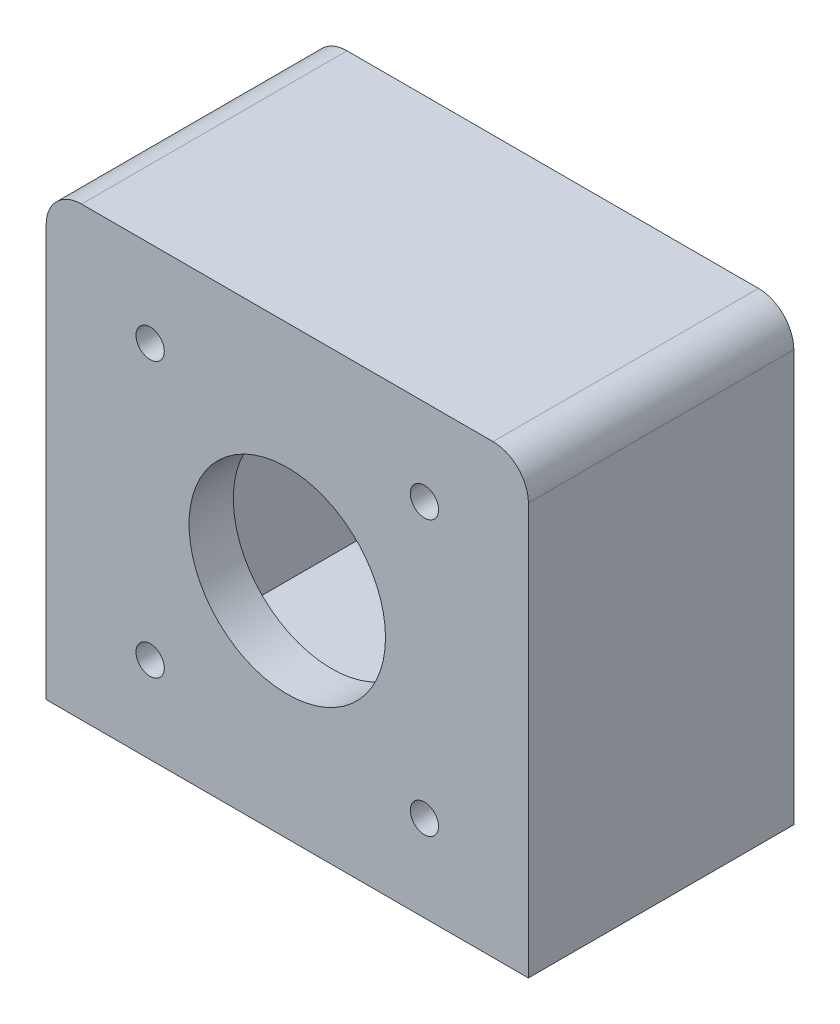
ISO-10303-21;
HEADER;
FILE_DESCRIPTION(('STEP AP214'),'2;1');
FILE_NAME('part.step','',(''),(''),'','','');
FILE_SCHEMA(('AUTOMOTIVE_DESIGN { 1 0 10303 214 1 1 1 1 }'));
ENDSEC;
DATA;
#1=APPLICATION_CONTEXT('core data for automotive mechanical design processes');
#2=APPLICATION_PROTOCOL_DEFINITION('international standard','automotive_design',2000,#1);
#3=PRODUCT_CONTEXT('',#1,'mechanical');
#4=PRODUCT('Part','Part','',(#3));
#5=PRODUCT_RELATED_PRODUCT_CATEGORY('part','',(#4));
#6=PRODUCT_DEFINITION_FORMATION('','',#4);
#7=PRODUCT_DEFINITION_CONTEXT('part definition',#1,'design');
#8=PRODUCT_DEFINITION('design','',#6,#7);
#9=PRODUCT_DEFINITION_SHAPE('','',#8);
#10=(LENGTH_UNIT() NAMED_UNIT(*) SI_UNIT(.MILLI.,.METRE.));
#11=(NAMED_UNIT(*) PLANE_ANGLE_UNIT() SI_UNIT($,.RADIAN.));
#12=(NAMED_UNIT(*) SI_UNIT($,.STERADIAN.) SOLID_ANGLE_UNIT());
#13=UNCERTAINTY_MEASURE_WITH_UNIT(LENGTH_MEASURE(1.E-05),#10,'distance_accuracy_value','');
#14=(GEOMETRIC_REPRESENTATION_CONTEXT(3) GLOBAL_UNCERTAINTY_ASSIGNED_CONTEXT((#13)) GLOBAL_UNIT_ASSIGNED_CONTEXT((#10,
#11,#12)) REPRESENTATION_CONTEXT('',''));
#15=CARTESIAN_POINT('',(0.,0.,0.));
#16=DIRECTION('',(0.,0.,1.));
#17=DIRECTION('',(1.,0.,0.));
#18=AXIS2_PLACEMENT_3D('',#15,#16,#17);
#19=CARTESIAN_POINT('',(0.,0.,0.));
#20=DIRECTION('',(0.,0.,1.));
#21=DIRECTION('',(1.,0.,0.));
#22=AXIS2_PLACEMENT_3D('',#19,#20,#21);
#23=PLANE('',#22);
#24=DIRECTION('',(0.,1.,0.));
#25=VECTOR('',#24,1.);
#26=CARTESIAN_POINT('',(21.25,-21.25,0.));
#27=LINE('',#26,#25);
#28=CARTESIAN_POINT('',(21.25,-21.25,0.));
#29=VERTEX_POINT('',#28);
#30=CARTESIAN_POINT('',(21.25,21.25,0.));
#31=VERTEX_POINT('',#30);
#32=EDGE_CURVE('E152',#29,#31,#27,.T.);
#33=ORIENTED_EDGE('',*,*,#32,.T.);
#34=DIRECTION('',(-1.,0.,0.));
#35=VECTOR('',#34,1.);
#36=CARTESIAN_POINT('',(-21.25,21.25,0.));
#37=LINE('',#36,#35);
#38=CARTESIAN_POINT('',(-21.25,21.25,0.));
#39=VERTEX_POINT('',#38);
#40=EDGE_CURVE('E186',#31,#39,#37,.T.);
#41=ORIENTED_EDGE('',*,*,#40,.T.);
#42=DIRECTION('',(0.,-1.,0.));
#43=VECTOR('',#42,1.);
#44=CARTESIAN_POINT('',(-21.25,-21.25,0.));
#45=LINE('',#44,#43);
#46=CARTESIAN_POINT('',(-21.25,-21.25,0.));
#47=VERTEX_POINT('',#46);
#48=EDGE_CURVE('E189',#39,#47,#45,.T.);
#49=ORIENTED_EDGE('',*,*,#48,.T.);
#50=DIRECTION('',(1.,0.,0.));
#51=VECTOR('',#50,1.);
#52=CARTESIAN_POINT('',(-21.25,-21.25,0.));
#53=LINE('',#52,#51);
#54=EDGE_CURVE('E174',#47,#29,#53,.T.);
#55=ORIENTED_EDGE('',*,*,#54,.T.);
#56=EDGE_LOOP('',(#33,#41,#49,#55));
#57=FACE_BOUND('',#56,.T.);
#58=DIRECTION('',(0.,-1.,0.));
#59=VECTOR('',#58,1.);
#60=CARTESIAN_POINT('',(-27.25,25.25,0.));
#61=LINE('',#60,#59);
#62=CARTESIAN_POINT('',(-27.25,21.25,0.));
#63=VERTEX_POINT('',#62);
#64=CARTESIAN_POINT('',(-27.25,-25.25,0.));
#65=VERTEX_POINT('',#64);
#66=EDGE_CURVE('E229',#63,#65,#61,.T.);
#67=ORIENTED_EDGE('',*,*,#66,.F.);
#68=CARTESIAN_POINT('',(-23.25,21.25,0.));
#69=DIRECTION('',(0.,0.,-1.));
#70=DIRECTION('',(-1.,0.,0.));
#71=AXIS2_PLACEMENT_3D('',#68,#69,#70);
#72=CIRCLE('',#71,4.);
#73=CARTESIAN_POINT('',(-23.25,25.25,0.));
#74=VERTEX_POINT('',#73);
#75=EDGE_CURVE('E56',#74,#63,#72,.F.);
#76=ORIENTED_EDGE('',*,*,#75,.F.);
#77=DIRECTION('',(-1.,0.,0.));
#78=VECTOR('',#77,1.);
#79=CARTESIAN_POINT('',(-25.25,25.25,0.));
#80=LINE('',#79,#78);
#81=CARTESIAN_POINT('',(23.25,25.25,0.));
#82=VERTEX_POINT('',#81);
#83=EDGE_CURVE('E11',#82,#74,#80,.T.);
#84=ORIENTED_EDGE('',*,*,#83,.F.);
#85=CARTESIAN_POINT('',(23.25,21.25,0.));
#86=DIRECTION('',(0.,0.,-1.));
#87=DIRECTION('',(-1.,0.,0.));
#88=AXIS2_PLACEMENT_3D('',#85,#86,#87);
#89=CIRCLE('',#88,4.);
#90=CARTESIAN_POINT('',(27.25,21.25,0.));
#91=VERTEX_POINT('',#90);
#92=EDGE_CURVE('E304',#82,#91,#89,.T.);
#93=ORIENTED_EDGE('',*,*,#92,.T.);
#94=DIRECTION('',(0.,1.,0.));
#95=VECTOR('',#94,1.);
#96=CARTESIAN_POINT('',(27.25,25.25,0.));
#97=LINE('',#96,#95);
#98=CARTESIAN_POINT('',(27.25,-25.25,0.));
#99=VERTEX_POINT('',#98);
#100=EDGE_CURVE('E222',#99,#91,#97,.T.);
#101=ORIENTED_EDGE('',*,*,#100,.F.);
#102=DIRECTION('',(1.,0.,0.));
#103=VECTOR('',#102,1.);
#104=CARTESIAN_POINT('',(-25.25,-25.25,0.));
#105=LINE('',#104,#103);
#106=EDGE_CURVE('E48',#65,#99,#105,.T.);
#107=ORIENTED_EDGE('',*,*,#106,.F.);
#108=EDGE_LOOP('',(#67,#76,#84,#93,#101,#107));
#109=FACE_BOUND('',#108,.T.);
#110=ADVANCED_FACE('F39',(#57,#109),#23,.F.);
#111=CARTESIAN_POINT('',(0.,0.,30.));
#112=DIRECTION('',(0.,0.,1.));
#113=DIRECTION('',(1.,0.,0.));
#114=AXIS2_PLACEMENT_3D('',#111,#112,#113);
#115=PLANE('',#114);
#116=CARTESIAN_POINT('',(-23.25,21.25,30.));
#117=DIRECTION('',(0.,0.,-1.));
#118=DIRECTION('',(-1.,0.,0.));
#119=AXIS2_PLACEMENT_3D('',#116,#117,#118);
#120=CIRCLE('',#119,4.);
#121=CARTESIAN_POINT('',(-23.25,25.25,30.));
#122=VERTEX_POINT('',#121);
#123=CARTESIAN_POINT('',(-27.25,21.25,30.));
#124=VERTEX_POINT('',#123);
#125=EDGE_CURVE('E116',#122,#124,#120,.F.);
#126=ORIENTED_EDGE('',*,*,#125,.T.);
#127=DIRECTION('',(0.,1.,0.));
#128=VECTOR('',#127,1.);
#129=CARTESIAN_POINT('',(-27.25,25.25,30.));
#130=LINE('',#129,#128);
#131=CARTESIAN_POINT('',(-27.25,-25.25,30.));
#132=VERTEX_POINT('',#131);
#133=EDGE_CURVE('E157',#132,#124,#130,.T.);
#134=ORIENTED_EDGE('',*,*,#133,.F.);
#135=DIRECTION('',(1.,0.,0.));
#136=VECTOR('',#135,1.);
#137=CARTESIAN_POINT('',(0.,-25.25,30.));
#138=LINE('',#137,#136);
#139=CARTESIAN_POINT('',(27.25,-25.25,30.));
#140=VERTEX_POINT('',#139);
#141=EDGE_CURVE('E136',#132,#140,#138,.T.);
#142=ORIENTED_EDGE('',*,*,#141,.T.);
#143=DIRECTION('',(0.,-1.,0.));
#144=VECTOR('',#143,1.);
#145=CARTESIAN_POINT('',(27.25,25.25,30.));
#146=LINE('',#145,#144);
#147=CARTESIAN_POINT('',(27.25,21.25,30.));
#148=VERTEX_POINT('',#147);
#149=EDGE_CURVE('E215',#148,#140,#146,.T.);
#150=ORIENTED_EDGE('',*,*,#149,.F.);
#151=CARTESIAN_POINT('',(23.25,21.25,30.));
#152=DIRECTION('',(0.,0.,-1.));
#153=DIRECTION('',(-1.,0.,0.));
#154=AXIS2_PLACEMENT_3D('',#151,#152,#153);
#155=CIRCLE('',#154,4.);
#156=CARTESIAN_POINT('',(23.25,25.25,30.));
#157=VERTEX_POINT('',#156);
#158=EDGE_CURVE('E64',#157,#148,#155,.T.);
#159=ORIENTED_EDGE('',*,*,#158,.F.);
#160=DIRECTION('',(1.,0.,0.));
#161=VECTOR('',#160,1.);
#162=CARTESIAN_POINT('',(0.,25.25,30.));
#163=LINE('',#162,#161);
#164=EDGE_CURVE('E130',#122,#157,#163,.T.);
#165=ORIENTED_EDGE('',*,*,#164,.F.);
#166=EDGE_LOOP('',(#126,#134,#142,#150,#159,#165));
#167=FACE_BOUND('',#166,.T.);
#168=CARTESIAN_POINT('',(0.,0.,30.));
#169=DIRECTION('',(0.,0.,1.));
#170=DIRECTION('',(1.,0.,0.));
#171=AXIS2_PLACEMENT_3D('',#168,#169,#170);
#172=CIRCLE('',#171,11.1);
#173=CARTESIAN_POINT('',(11.1,0.,30.));
#174=VERTEX_POINT('',#173);
#175=EDGE_CURVE('E169',#174,#174,#172,.T.);
#176=ORIENTED_EDGE('',*,*,#175,.F.);
#177=EDGE_LOOP('',(#176));
#178=FACE_BOUND('',#177,.T.);
#179=CARTESIAN_POINT('',(15.5,15.5,30.));
#180=DIRECTION('',(0.,0.,1.));
#181=DIRECTION('',(1.,0.,0.));
#182=AXIS2_PLACEMENT_3D('',#179,#180,#181);
#183=CIRCLE('',#182,1.6);
#184=CARTESIAN_POINT('',(17.1,15.5,30.));
#185=VERTEX_POINT('',#184);
#186=EDGE_CURVE('E143',#185,#185,#183,.F.);
#187=ORIENTED_EDGE('',*,*,#186,.T.);
#188=EDGE_LOOP('',(#187));
#189=FACE_BOUND('',#188,.T.);
#190=CARTESIAN_POINT('',(-15.5,15.5,30.));
#191=DIRECTION('',(0.,0.,1.));
#192=DIRECTION('',(1.,0.,0.));
#193=AXIS2_PLACEMENT_3D('',#190,#191,#192);
#194=CIRCLE('',#193,1.6);
#195=CARTESIAN_POINT('',(-13.9,15.5,30.));
#196=VERTEX_POINT('',#195);
#197=EDGE_CURVE('E137',#196,#196,#194,.T.);
#198=ORIENTED_EDGE('',*,*,#197,.F.);
#199=EDGE_LOOP('',(#198));
#200=FACE_BOUND('',#199,.T.);
#201=CARTESIAN_POINT('',(15.5,-15.5,30.));
#202=DIRECTION('',(0.,0.,1.));
#203=DIRECTION('',(1.,0.,0.));
#204=AXIS2_PLACEMENT_3D('',#201,#202,#203);
#205=CIRCLE('',#204,1.6);
#206=CARTESIAN_POINT('',(17.1,-15.5,30.));
#207=VERTEX_POINT('',#206);
#208=EDGE_CURVE('E140',#207,#207,#205,.T.);
#209=ORIENTED_EDGE('',*,*,#208,.F.);
#210=EDGE_LOOP('',(#209));
#211=FACE_BOUND('',#210,.T.);
#212=CARTESIAN_POINT('',(-15.5,-15.5,30.));
#213=DIRECTION('',(0.,0.,1.));
#214=DIRECTION('',(1.,0.,0.));
#215=AXIS2_PLACEMENT_3D('',#212,#213,#214);
#216=CIRCLE('',#215,1.6);
#217=CARTESIAN_POINT('',(-13.9,-15.5,30.));
#218=VERTEX_POINT('',#217);
#219=EDGE_CURVE('E149',#218,#218,#216,.F.);
#220=ORIENTED_EDGE('',*,*,#219,.T.);
#221=EDGE_LOOP('',(#220));
#222=FACE_BOUND('',#221,.T.);
#223=ADVANCED_FACE('F133',(#167,#178,#189,#200,#211,#222),#115,.T.);
#224=CARTESIAN_POINT('',(-25.25,-25.25,25.));
#225=DIRECTION('',(0.,1.,0.));
#226=DIRECTION('',(0.,0.,1.));
#227=AXIS2_PLACEMENT_3D('',#224,#225,#226);
#228=PLANE('',#227);
#229=CARTESIAN_POINT('',(24.25,-25.25,27.));
#230=DIRECTION('',(0.,1.,0.));
#231=DIRECTION('',(0.,0.,1.));
#232=AXIS2_PLACEMENT_3D('',#229,#230,#231);
#233=CIRCLE('',#232,1.95);
#234=CARTESIAN_POINT('',(24.25,-25.25,28.95));
#235=VERTEX_POINT('',#234);
#236=EDGE_CURVE('E43',#235,#235,#233,.T.);
#237=ORIENTED_EDGE('',*,*,#236,.T.);
#238=EDGE_LOOP('',(#237));
#239=FACE_BOUND('',#238,.T.);
#240=CARTESIAN_POINT('',(-24.2500000000003,-25.25,26.9999999999997));
#241=DIRECTION('',(0.,1.,0.));
#242=DIRECTION('',(0.,0.,1.));
#243=AXIS2_PLACEMENT_3D('',#240,#241,#242);
#244=CIRCLE('',#243,1.95);
#245=CARTESIAN_POINT('',(-24.2500000000003,-25.25,28.9499999999997));
#246=VERTEX_POINT('',#245);
#247=EDGE_CURVE('E210',#246,#246,#244,.T.);
#248=ORIENTED_EDGE('',*,*,#247,.T.);
#249=EDGE_LOOP('',(#248));
#250=FACE_BOUND('',#249,.T.);
#251=CARTESIAN_POINT('',(-24.2500000000003,-25.25,3.00000000000031));
#252=DIRECTION('',(0.,1.,0.));
#253=DIRECTION('',(0.,0.,1.));
#254=AXIS2_PLACEMENT_3D('',#251,#252,#253);
#255=CIRCLE('',#254,1.95);
#256=CARTESIAN_POINT('',(-24.2500000000003,-25.25,4.95000000000031));
#257=VERTEX_POINT('',#256);
#258=EDGE_CURVE('E207',#257,#257,#255,.T.);
#259=ORIENTED_EDGE('',*,*,#258,.T.);
#260=EDGE_LOOP('',(#259));
#261=FACE_BOUND('',#260,.T.);
#262=CARTESIAN_POINT('',(24.25,-25.25,3.));
#263=DIRECTION('',(0.,1.,0.));
#264=DIRECTION('',(0.,0.,1.));
#265=AXIS2_PLACEMENT_3D('',#262,#263,#264);
#266=CIRCLE('',#265,1.95);
#267=CARTESIAN_POINT('',(24.25,-25.25,4.95));
#268=VERTEX_POINT('',#267);
#269=EDGE_CURVE('E204',#268,#268,#266,.T.);
#270=ORIENTED_EDGE('',*,*,#269,.T.);
#271=EDGE_LOOP('',(#270));
#272=FACE_BOUND('',#271,.T.);
#273=ORIENTED_EDGE('',*,*,#106,.T.);
#274=DIRECTION('',(0.,0.,-1.));
#275=VECTOR('',#274,1.);
#276=CARTESIAN_POINT('',(27.25,-25.25,30.));
#277=LINE('',#276,#275);
#278=EDGE_CURVE('E218',#140,#99,#277,.T.);
#279=ORIENTED_EDGE('',*,*,#278,.F.);
#280=ORIENTED_EDGE('',*,*,#141,.F.);
#281=DIRECTION('',(0.,0.,1.));
#282=VECTOR('',#281,1.);
#283=CARTESIAN_POINT('',(-27.25,-25.25,0.));
#284=LINE('',#283,#282);
#285=EDGE_CURVE('E231',#65,#132,#284,.T.);
#286=ORIENTED_EDGE('',*,*,#285,.F.);
#287=EDGE_LOOP('',(#273,#279,#280,#286));
#288=FACE_BOUND('',#287,.T.);
#289=ADVANCED_FACE('F41',(#239,#250,#261,#272,#288),#228,.F.);
#290=CARTESIAN_POINT('',(-25.25,25.25,25.));
#291=DIRECTION('',(0.,-1.,0.));
#292=DIRECTION('',(0.,0.,-1.));
#293=AXIS2_PLACEMENT_3D('',#290,#291,#292);
#294=PLANE('',#293);
#295=ORIENTED_EDGE('',*,*,#83,.T.);
#296=DIRECTION('',(0.,0.,-1.));
#297=VECTOR('',#296,1.);
#298=CARTESIAN_POINT('',(-23.25,25.25,30.));
#299=LINE('',#298,#297);
#300=EDGE_CURVE('E119',#122,#74,#299,.T.);
#301=ORIENTED_EDGE('',*,*,#300,.F.);
#302=ORIENTED_EDGE('',*,*,#164,.T.);
#303=DIRECTION('',(0.,0.,-1.));
#304=VECTOR('',#303,1.);
#305=CARTESIAN_POINT('',(23.25,25.25,30.));
#306=LINE('',#305,#304);
#307=EDGE_CURVE('E306',#157,#82,#306,.T.);
#308=ORIENTED_EDGE('',*,*,#307,.T.);
#309=EDGE_LOOP('',(#295,#301,#302,#308));
#310=FACE_BOUND('',#309,.T.);
#311=ADVANCED_FACE('F128',(#310),#294,.F.);
#312=CARTESIAN_POINT('',(21.25,-21.25,25.));
#313=DIRECTION('',(-1.,0.,0.));
#314=DIRECTION('',(0.,0.,1.));
#315=AXIS2_PLACEMENT_3D('',#312,#313,#314);
#316=PLANE('',#315);
#317=ORIENTED_EDGE('',*,*,#32,.F.);
#318=DIRECTION('',(0.,0.,-1.));
#319=VECTOR('',#318,1.);
#320=CARTESIAN_POINT('',(21.25,-21.25,25.));
#321=LINE('',#320,#319);
#322=CARTESIAN_POINT('',(21.25,-21.25,25.));
#323=VERTEX_POINT('',#322);
#324=EDGE_CURVE('E183',#323,#29,#321,.T.);
#325=ORIENTED_EDGE('',*,*,#324,.F.);
#326=DIRECTION('',(0.,1.,0.));
#327=VECTOR('',#326,1.);
#328=CARTESIAN_POINT('',(21.25,-21.25,25.));
#329=LINE('',#328,#327);
#330=CARTESIAN_POINT('',(21.25,21.25,25.));
#331=VERTEX_POINT('',#330);
#332=EDGE_CURVE('E170',#323,#331,#329,.T.);
#333=ORIENTED_EDGE('',*,*,#332,.T.);
#334=DIRECTION('',(0.,0.,-1.));
#335=VECTOR('',#334,1.);
#336=CARTESIAN_POINT('',(21.25,21.25,25.));
#337=LINE('',#336,#335);
#338=EDGE_CURVE('E200',#331,#31,#337,.T.);
#339=ORIENTED_EDGE('',*,*,#338,.T.);
#340=EDGE_LOOP('',(#317,#325,#333,#339));
#341=FACE_BOUND('',#340,.T.);
#342=ADVANCED_FACE('F281',(#341),#316,.T.);
#343=CARTESIAN_POINT('',(-21.25,21.25,25.));
#344=DIRECTION('',(0.,-1.,0.));
#345=DIRECTION('',(0.,0.,-1.));
#346=AXIS2_PLACEMENT_3D('',#343,#344,#345);
#347=PLANE('',#346);
#348=ORIENTED_EDGE('',*,*,#40,.F.);
#349=ORIENTED_EDGE('',*,*,#338,.F.);
#350=DIRECTION('',(-1.,0.,0.));
#351=VECTOR('',#350,1.);
#352=CARTESIAN_POINT('',(-21.25,21.25,25.));
#353=LINE('',#352,#351);
#354=CARTESIAN_POINT('',(-21.25,21.25,25.));
#355=VERTEX_POINT('',#354);
#356=EDGE_CURVE('E173',#331,#355,#353,.T.);
#357=ORIENTED_EDGE('',*,*,#356,.T.);
#358=DIRECTION('',(0.,0.,-1.));
#359=VECTOR('',#358,1.);
#360=CARTESIAN_POINT('',(-21.25,21.25,25.));
#361=LINE('',#360,#359);
#362=EDGE_CURVE('E198',#355,#39,#361,.T.);
#363=ORIENTED_EDGE('',*,*,#362,.T.);
#364=EDGE_LOOP('',(#348,#349,#357,#363));
#365=FACE_BOUND('',#364,.T.);
#366=ADVANCED_FACE('F288',(#365),#347,.T.);
#367=CARTESIAN_POINT('',(-21.25,-21.25,25.));
#368=DIRECTION('',(1.,0.,0.));
#369=DIRECTION('',(0.,0.,-1.));
#370=AXIS2_PLACEMENT_3D('',#367,#368,#369);
#371=PLANE('',#370);
#372=ORIENTED_EDGE('',*,*,#48,.F.);
#373=ORIENTED_EDGE('',*,*,#362,.F.);
#374=DIRECTION('',(0.,-1.,0.));
#375=VECTOR('',#374,1.);
#376=CARTESIAN_POINT('',(-21.25,-21.25,25.));
#377=LINE('',#376,#375);
#378=CARTESIAN_POINT('',(-21.25,-21.25,25.));
#379=VERTEX_POINT('',#378);
#380=EDGE_CURVE('E177',#355,#379,#377,.T.);
#381=ORIENTED_EDGE('',*,*,#380,.T.);
#382=DIRECTION('',(0.,0.,-1.));
#383=VECTOR('',#382,1.);
#384=CARTESIAN_POINT('',(-21.25,-21.25,25.));
#385=LINE('',#384,#383);
#386=EDGE_CURVE('E196',#379,#47,#385,.T.);
#387=ORIENTED_EDGE('',*,*,#386,.T.);
#388=EDGE_LOOP('',(#372,#373,#381,#387));
#389=FACE_BOUND('',#388,.T.);
#390=ADVANCED_FACE('F541',(#389),#371,.T.);
#391=CARTESIAN_POINT('',(-21.25,-21.25,25.));
#392=DIRECTION('',(0.,1.,0.));
#393=DIRECTION('',(0.,0.,1.));
#394=AXIS2_PLACEMENT_3D('',#391,#392,#393);
#395=PLANE('',#394);
#396=ORIENTED_EDGE('',*,*,#54,.F.);
#397=ORIENTED_EDGE('',*,*,#386,.F.);
#398=DIRECTION('',(1.,0.,0.));
#399=VECTOR('',#398,1.);
#400=CARTESIAN_POINT('',(-21.25,-21.25,25.));
#401=LINE('',#400,#399);
#402=EDGE_CURVE('E180',#379,#323,#401,.T.);
#403=ORIENTED_EDGE('',*,*,#402,.T.);
#404=ORIENTED_EDGE('',*,*,#324,.T.);
#405=EDGE_LOOP('',(#396,#397,#403,#404));
#406=FACE_BOUND('',#405,.T.);
#407=ADVANCED_FACE('F531',(#406),#395,.T.);
#408=CARTESIAN_POINT('',(15.5,-15.5,30.));
#409=DIRECTION('',(0.,0.,-1.));
#410=DIRECTION('',(-1.,0.,0.));
#411=AXIS2_PLACEMENT_3D('',#408,#409,#410);
#412=CYLINDRICAL_SURFACE('',#411,1.6);
#413=ORIENTED_EDGE('',*,*,#208,.T.);
#414=EDGE_LOOP('',(#413));
#415=FACE_BOUND('',#414,.T.);
#416=CARTESIAN_POINT('',(15.5,-15.5,25.));
#417=DIRECTION('',(0.,0.,1.));
#418=DIRECTION('',(1.,0.,0.));
#419=AXIS2_PLACEMENT_3D('',#416,#417,#418);
#420=CIRCLE('',#419,1.6);
#421=CARTESIAN_POINT('',(17.1,-15.5,25.));
#422=VERTEX_POINT('',#421);
#423=EDGE_CURVE('E163',#422,#422,#420,.T.);
#424=ORIENTED_EDGE('',*,*,#423,.F.);
#425=EDGE_LOOP('',(#424));
#426=FACE_BOUND('',#425,.T.);
#427=ADVANCED_FACE('F521',(#415,#426),#412,.F.);
#428=CARTESIAN_POINT('',(-15.5,15.5,30.));
#429=DIRECTION('',(0.,0.,-1.));
#430=DIRECTION('',(-1.,0.,0.));
#431=AXIS2_PLACEMENT_3D('',#428,#429,#430);
#432=CYLINDRICAL_SURFACE('',#431,1.6);
#433=ORIENTED_EDGE('',*,*,#197,.T.);
#434=EDGE_LOOP('',(#433));
#435=FACE_BOUND('',#434,.T.);
#436=CARTESIAN_POINT('',(-15.5,15.5,25.));
#437=DIRECTION('',(0.,0.,1.));
#438=DIRECTION('',(1.,0.,0.));
#439=AXIS2_PLACEMENT_3D('',#436,#437,#438);
#440=CIRCLE('',#439,1.6);
#441=CARTESIAN_POINT('',(-13.9,15.5,25.));
#442=VERTEX_POINT('',#441);
#443=EDGE_CURVE('E160',#442,#442,#440,.T.);
#444=ORIENTED_EDGE('',*,*,#443,.F.);
#445=EDGE_LOOP('',(#444));
#446=FACE_BOUND('',#445,.T.);
#447=ADVANCED_FACE('F245',(#435,#446),#432,.F.);
#448=CARTESIAN_POINT('',(15.5,15.5,30.));
#449=DIRECTION('',(0.,0.,-1.));
#450=DIRECTION('',(-1.,0.,0.));
#451=AXIS2_PLACEMENT_3D('',#448,#449,#450);
#452=CYLINDRICAL_SURFACE('',#451,1.6);
#453=ORIENTED_EDGE('',*,*,#186,.F.);
#454=EDGE_LOOP('',(#453));
#455=FACE_BOUND('',#454,.T.);
#456=CARTESIAN_POINT('',(15.5,15.5,25.));
#457=DIRECTION('',(0.,0.,1.));
#458=DIRECTION('',(1.,0.,0.));
#459=AXIS2_PLACEMENT_3D('',#456,#457,#458);
#460=CIRCLE('',#459,1.6);
#461=CARTESIAN_POINT('',(17.1,15.5,25.));
#462=VERTEX_POINT('',#461);
#463=EDGE_CURVE('E156',#462,#462,#460,.F.);
#464=ORIENTED_EDGE('',*,*,#463,.T.);
#465=EDGE_LOOP('',(#464));
#466=FACE_BOUND('',#465,.T.);
#467=ADVANCED_FACE('F241',(#455,#466),#452,.F.);
#468=CARTESIAN_POINT('',(0.,0.,30.));
#469=DIRECTION('',(0.,0.,-1.));
#470=DIRECTION('',(-1.,0.,0.));
#471=AXIS2_PLACEMENT_3D('',#468,#469,#470);
#472=CYLINDRICAL_SURFACE('',#471,11.1);
#473=ORIENTED_EDGE('',*,*,#175,.T.);
#474=EDGE_LOOP('',(#473));
#475=FACE_BOUND('',#474,.T.);
#476=CARTESIAN_POINT('',(0.,0.,25.));
#477=DIRECTION('',(0.,0.,1.));
#478=DIRECTION('',(1.,0.,0.));
#479=AXIS2_PLACEMENT_3D('',#476,#477,#478);
#480=CIRCLE('',#479,11.1);
#481=CARTESIAN_POINT('',(11.1,0.,25.));
#482=VERTEX_POINT('',#481);
#483=EDGE_CURVE('E153',#482,#482,#480,.T.);
#484=ORIENTED_EDGE('',*,*,#483,.F.);
#485=EDGE_LOOP('',(#484));
#486=FACE_BOUND('',#485,.T.);
#487=ADVANCED_FACE('F244',(#475,#486),#472,.F.);
#488=CARTESIAN_POINT('',(-15.5,-15.5,30.));
#489=DIRECTION('',(0.,0.,-1.));
#490=DIRECTION('',(-1.,0.,0.));
#491=AXIS2_PLACEMENT_3D('',#488,#489,#490);
#492=CYLINDRICAL_SURFACE('',#491,1.6);
#493=ORIENTED_EDGE('',*,*,#219,.F.);
#494=EDGE_LOOP('',(#493));
#495=FACE_BOUND('',#494,.T.);
#496=CARTESIAN_POINT('',(-15.5,-15.5,25.));
#497=DIRECTION('',(0.,0.,1.));
#498=DIRECTION('',(1.,0.,0.));
#499=AXIS2_PLACEMENT_3D('',#496,#497,#498);
#500=CIRCLE('',#499,1.6);
#501=CARTESIAN_POINT('',(-13.9,-15.5,25.));
#502=VERTEX_POINT('',#501);
#503=EDGE_CURVE('E166',#502,#502,#500,.F.);
#504=ORIENTED_EDGE('',*,*,#503,.T.);
#505=EDGE_LOOP('',(#504));
#506=FACE_BOUND('',#505,.T.);
#507=ADVANCED_FACE('F253',(#495,#506),#492,.F.);
#508=CARTESIAN_POINT('',(0.,0.,25.));
#509=DIRECTION('',(0.,0.,1.));
#510=DIRECTION('',(1.,0.,0.));
#511=AXIS2_PLACEMENT_3D('',#508,#509,#510);
#512=PLANE('',#511);
#513=ORIENTED_EDGE('',*,*,#356,.F.);
#514=ORIENTED_EDGE('',*,*,#332,.F.);
#515=ORIENTED_EDGE('',*,*,#402,.F.);
#516=ORIENTED_EDGE('',*,*,#380,.F.);
#517=EDGE_LOOP('',(#513,#514,#515,#516));
#518=FACE_BOUND('',#517,.T.);
#519=ORIENTED_EDGE('',*,*,#483,.T.);
#520=EDGE_LOOP('',(#519));
#521=FACE_BOUND('',#520,.T.);
#522=ORIENTED_EDGE('',*,*,#463,.F.);
#523=EDGE_LOOP('',(#522));
#524=FACE_BOUND('',#523,.T.);
#525=ORIENTED_EDGE('',*,*,#443,.T.);
#526=EDGE_LOOP('',(#525));
#527=FACE_BOUND('',#526,.T.);
#528=ORIENTED_EDGE('',*,*,#423,.T.);
#529=EDGE_LOOP('',(#528));
#530=FACE_BOUND('',#529,.T.);
#531=ORIENTED_EDGE('',*,*,#503,.F.);
#532=EDGE_LOOP('',(#531));
#533=FACE_BOUND('',#532,.T.);
#534=ADVANCED_FACE('F249',(#518,#521,#524,#527,#530,#533),#512,.F.);
#535=CARTESIAN_POINT('',(-27.25,0.,0.));
#536=DIRECTION('',(-1.,0.,0.));
#537=DIRECTION('',(0.,0.,1.));
#538=AXIS2_PLACEMENT_3D('',#535,#536,#537);
#539=PLANE('',#538);
#540=DIRECTION('',(0.,0.,-1.));
#541=VECTOR('',#540,1.);
#542=CARTESIAN_POINT('',(-27.25,21.25,30.));
#543=LINE('',#542,#541);
#544=EDGE_CURVE('E120',#124,#63,#543,.T.);
#545=ORIENTED_EDGE('',*,*,#544,.T.);
#546=ORIENTED_EDGE('',*,*,#66,.T.);
#547=ORIENTED_EDGE('',*,*,#285,.T.);
#548=ORIENTED_EDGE('',*,*,#133,.T.);
#549=EDGE_LOOP('',(#545,#546,#547,#548));
#550=FACE_BOUND('',#549,.T.);
#551=ADVANCED_FACE('F252',(#550),#539,.T.);
#552=CARTESIAN_POINT('',(27.25,0.,0.));
#553=DIRECTION('',(1.,0.,0.));
#554=DIRECTION('',(0.,0.,-1.));
#555=AXIS2_PLACEMENT_3D('',#552,#553,#554);
#556=PLANE('',#555);
#557=DIRECTION('',(0.,0.,-1.));
#558=VECTOR('',#557,1.);
#559=CARTESIAN_POINT('',(27.25,21.25,30.));
#560=LINE('',#559,#558);
#561=EDGE_CURVE('E309',#148,#91,#560,.T.);
#562=ORIENTED_EDGE('',*,*,#561,.F.);
#563=ORIENTED_EDGE('',*,*,#149,.T.);
#564=ORIENTED_EDGE('',*,*,#278,.T.);
#565=ORIENTED_EDGE('',*,*,#100,.T.);
#566=EDGE_LOOP('',(#562,#563,#564,#565));
#567=FACE_BOUND('',#566,.T.);
#568=ADVANCED_FACE('F302',(#567),#556,.T.);
#569=CARTESIAN_POINT('',(24.25,-21.6000000000002,3.));
#570=DIRECTION('',(0.,-1.,0.));
#571=DIRECTION('',(1.,0.,0.));
#572=AXIS2_PLACEMENT_3D('',#569,#570,#571);
#573=CYLINDRICAL_SURFACE('',#572,1.95);
#574=CARTESIAN_POINT('',(24.25,-21.6000000000002,3.));
#575=DIRECTION('',(0.,-1.,0.));
#576=DIRECTION('',(1.,0.,0.));
#577=AXIS2_PLACEMENT_3D('',#574,#575,#576);
#578=CIRCLE('',#577,1.95);
#579=CARTESIAN_POINT('',(26.2,-21.6000000000002,3.));
#580=VERTEX_POINT('',#579);
#581=EDGE_CURVE('E208',#580,#580,#578,.T.);
#582=ORIENTED_EDGE('',*,*,#581,.F.);
#583=EDGE_LOOP('',(#582));
#584=FACE_BOUND('',#583,.T.);
#585=ORIENTED_EDGE('',*,*,#269,.F.);
#586=EDGE_LOOP('',(#585));
#587=FACE_BOUND('',#586,.T.);
#588=ADVANCED_FACE('F329',(#584,#587),#573,.F.);
#589=CARTESIAN_POINT('',(24.25,-21.6000000000002,3.));
#590=DIRECTION('',(0.,-1.,0.));
#591=DIRECTION('',(1.,0.,0.));
#592=AXIS2_PLACEMENT_3D('',#589,#590,#591);
#593=PLANE('',#592);
#594=ORIENTED_EDGE('',*,*,#581,.T.);
#595=EDGE_LOOP('',(#594));
#596=FACE_BOUND('',#595,.T.);
#597=ADVANCED_FACE('F334',(#596),#593,.T.);
#598=CARTESIAN_POINT('',(-24.2500000000003,-21.5999999999998,3.00000000000031));
#599=DIRECTION('',(0.,-1.,0.));
#600=DIRECTION('',(1.,0.,0.));
#601=AXIS2_PLACEMENT_3D('',#598,#599,#600);
#602=CYLINDRICAL_SURFACE('',#601,1.95);
#603=CARTESIAN_POINT('',(-24.2500000000003,-21.5999999999998,3.00000000000031));
#604=DIRECTION('',(0.,-1.,0.));
#605=DIRECTION('',(-1.,0.,0.));
#606=AXIS2_PLACEMENT_3D('',#603,#604,#605);
#607=CIRCLE('',#606,1.95);
#608=CARTESIAN_POINT('',(-26.2000000000003,-21.5999999999998,3.00000000000031));
#609=VERTEX_POINT('',#608);
#610=EDGE_CURVE('E312',#609,#609,#607,.T.);
#611=ORIENTED_EDGE('',*,*,#610,.F.);
#612=EDGE_LOOP('',(#611));
#613=FACE_BOUND('',#612,.T.);
#614=ORIENTED_EDGE('',*,*,#258,.F.);
#615=EDGE_LOOP('',(#614));
#616=FACE_BOUND('',#615,.T.);
#617=ADVANCED_FACE('F338',(#613,#616),#602,.F.);
#618=CARTESIAN_POINT('',(-24.2500000000003,-21.5999999999998,3.00000000000031));
#619=DIRECTION('',(0.,1.,0.));
#620=DIRECTION('',(-1.,0.,0.));
#621=AXIS2_PLACEMENT_3D('',#618,#619,#620);
#622=PLANE('',#621);
#623=ORIENTED_EDGE('',*,*,#610,.T.);
#624=EDGE_LOOP('',(#623));
#625=FACE_BOUND('',#624,.T.);
#626=ADVANCED_FACE('F355',(#625),#622,.F.);
#627=CARTESIAN_POINT('',(-24.2500000000003,-21.5999999999998,26.9999999999997));
#628=DIRECTION('',(0.,-1.,0.));
#629=DIRECTION('',(1.,0.,0.));
#630=AXIS2_PLACEMENT_3D('',#627,#628,#629);
#631=CYLINDRICAL_SURFACE('',#630,1.95);
#632=CARTESIAN_POINT('',(-24.2500000000003,-21.5999999999998,26.9999999999997));
#633=DIRECTION('',(0.,-1.,0.));
#634=DIRECTION('',(1.,0.,0.));
#635=AXIS2_PLACEMENT_3D('',#632,#633,#634);
#636=CIRCLE('',#635,1.95);
#637=CARTESIAN_POINT('',(-22.3000000000003,-21.5999999999998,26.9999999999997));
#638=VERTEX_POINT('',#637);
#639=EDGE_CURVE('E315',#638,#638,#636,.T.);
#640=ORIENTED_EDGE('',*,*,#639,.F.);
#641=EDGE_LOOP('',(#640));
#642=FACE_BOUND('',#641,.T.);
#643=ORIENTED_EDGE('',*,*,#247,.F.);
#644=EDGE_LOOP('',(#643));
#645=FACE_BOUND('',#644,.T.);
#646=ADVANCED_FACE('F351',(#642,#645),#631,.F.);
#647=CARTESIAN_POINT('',(-24.2500000000003,-21.5999999999998,26.9999999999997));
#648=DIRECTION('',(0.,-1.,0.));
#649=DIRECTION('',(1.,0.,0.));
#650=AXIS2_PLACEMENT_3D('',#647,#648,#649);
#651=PLANE('',#650);
#652=ORIENTED_EDGE('',*,*,#639,.T.);
#653=EDGE_LOOP('',(#652));
#654=FACE_BOUND('',#653,.T.);
#655=ADVANCED_FACE('F347',(#654),#651,.T.);
#656=CARTESIAN_POINT('',(24.25,-21.6000000000002,27.));
#657=DIRECTION('',(0.,-1.,0.));
#658=DIRECTION('',(1.,0.,0.));
#659=AXIS2_PLACEMENT_3D('',#656,#657,#658);
#660=CYLINDRICAL_SURFACE('',#659,1.95);
#661=CARTESIAN_POINT('',(24.25,-21.6000000000002,27.));
#662=DIRECTION('',(0.,-1.,0.));
#663=DIRECTION('',(-1.,0.,0.));
#664=AXIS2_PLACEMENT_3D('',#661,#662,#663);
#665=CIRCLE('',#664,1.95);
#666=CARTESIAN_POINT('',(22.3000000000001,-21.6000000000002,27.));
#667=VERTEX_POINT('',#666);
#668=EDGE_CURVE('E317',#667,#667,#665,.T.);
#669=ORIENTED_EDGE('',*,*,#668,.F.);
#670=EDGE_LOOP('',(#669));
#671=FACE_BOUND('',#670,.T.);
#672=ORIENTED_EDGE('',*,*,#236,.F.);
#673=EDGE_LOOP('',(#672));
#674=FACE_BOUND('',#673,.T.);
#675=ADVANCED_FACE('F344',(#671,#674),#660,.F.);
#676=CARTESIAN_POINT('',(24.25,-21.6000000000002,27.));
#677=DIRECTION('',(0.,1.,0.));
#678=DIRECTION('',(-1.,0.,0.));
#679=AXIS2_PLACEMENT_3D('',#676,#677,#678);
#680=PLANE('',#679);
#681=ORIENTED_EDGE('',*,*,#668,.T.);
#682=EDGE_LOOP('',(#681));
#683=FACE_BOUND('',#682,.T.);
#684=ADVANCED_FACE('F340',(#683),#680,.F.);
#685=CARTESIAN_POINT('',(23.25,21.25,30.));
#686=DIRECTION('',(0.,0.,-1.));
#687=DIRECTION('',(-1.,0.,0.));
#688=AXIS2_PLACEMENT_3D('',#685,#686,#687);
#689=CYLINDRICAL_SURFACE('',#688,4.);
#690=ORIENTED_EDGE('',*,*,#92,.F.);
#691=ORIENTED_EDGE('',*,*,#307,.F.);
#692=ORIENTED_EDGE('',*,*,#158,.T.);
#693=ORIENTED_EDGE('',*,*,#561,.T.);
#694=EDGE_LOOP('',(#690,#691,#692,#693));
#695=FACE_BOUND('',#694,.T.);
#696=ADVANCED_FACE('F343',(#695),#689,.T.);
#697=CARTESIAN_POINT('',(-23.25,21.25,30.));
#698=DIRECTION('',(0.,0.,-1.));
#699=DIRECTION('',(-1.,0.,0.));
#700=AXIS2_PLACEMENT_3D('',#697,#698,#699);
#701=CYLINDRICAL_SURFACE('',#700,4.);
#702=ORIENTED_EDGE('',*,*,#75,.T.);
#703=ORIENTED_EDGE('',*,*,#544,.F.);
#704=ORIENTED_EDGE('',*,*,#125,.F.);
#705=ORIENTED_EDGE('',*,*,#300,.T.);
#706=EDGE_LOOP('',(#702,#703,#704,#705));
#707=FACE_BOUND('',#706,.T.);
#708=ADVANCED_FACE('F118',(#707),#701,.T.);
#709=CLOSED_SHELL('',(#110,#223,#289,#311,#342,#366,#390,#407,#427,#447,#467,#487,#507,#534,
#551,#568,#588,#597,#617,#626,#646,#655,#675,#684,#696,#708));
#710=MANIFOLD_SOLID_BREP('B2',#709);
#711=ADVANCED_BREP_SHAPE_REPRESENTATION('',(#18,#710),#14);
#712=SHAPE_DEFINITION_REPRESENTATION(#9,#711);
ENDSEC;
END-ISO-10303-21;
